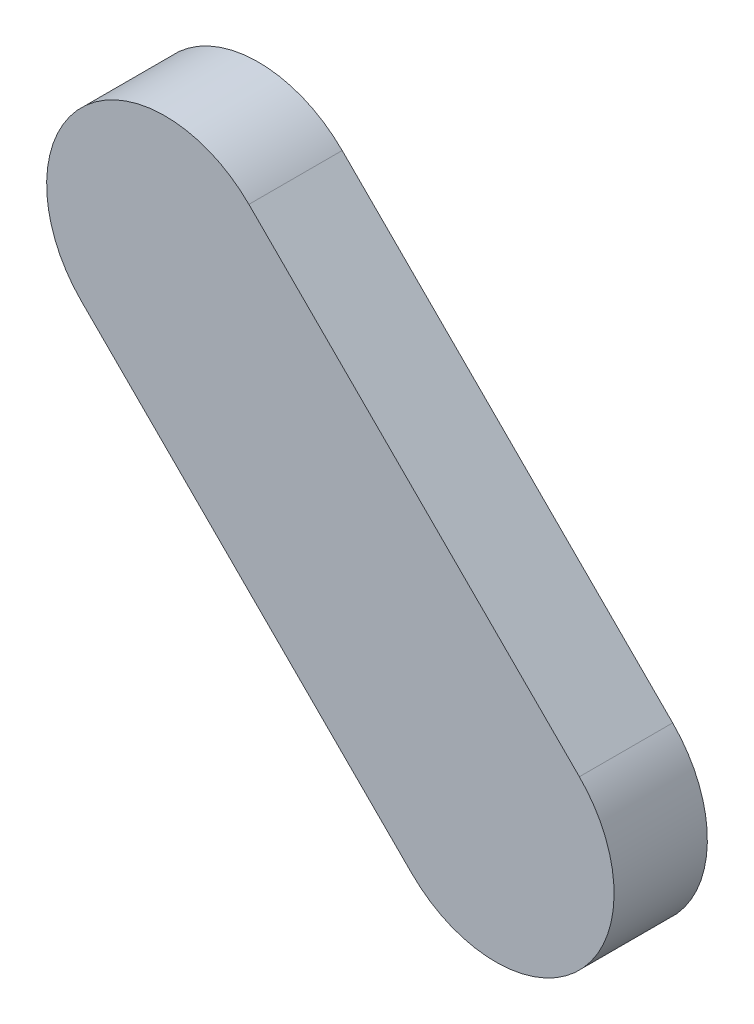
ISO-10303-21;
HEADER;
FILE_DESCRIPTION(('STEP AP214'),'2;1');
FILE_NAME('part.step','',(''),(''),'','','');
FILE_SCHEMA(('AUTOMOTIVE_DESIGN { 1 0 10303 214 1 1 1 1 }'));
ENDSEC;
DATA;
#1=APPLICATION_CONTEXT('core data for automotive mechanical design processes');
#2=APPLICATION_PROTOCOL_DEFINITION('international standard','automotive_design',2000,#1);
#3=PRODUCT_CONTEXT('',#1,'mechanical');
#4=PRODUCT('Part','Part','',(#3));
#5=PRODUCT_RELATED_PRODUCT_CATEGORY('part','',(#4));
#6=PRODUCT_DEFINITION_FORMATION('','',#4);
#7=PRODUCT_DEFINITION_CONTEXT('part definition',#1,'design');
#8=PRODUCT_DEFINITION('design','',#6,#7);
#9=PRODUCT_DEFINITION_SHAPE('','',#8);
#10=(LENGTH_UNIT() NAMED_UNIT(*) SI_UNIT(.MILLI.,.METRE.));
#11=(NAMED_UNIT(*) PLANE_ANGLE_UNIT() SI_UNIT($,.RADIAN.));
#12=(NAMED_UNIT(*) SI_UNIT($,.STERADIAN.) SOLID_ANGLE_UNIT());
#13=UNCERTAINTY_MEASURE_WITH_UNIT(LENGTH_MEASURE(1.E-05),#10,'distance_accuracy_value','');
#14=(GEOMETRIC_REPRESENTATION_CONTEXT(3) GLOBAL_UNCERTAINTY_ASSIGNED_CONTEXT((#13)) GLOBAL_UNIT_ASSIGNED_CONTEXT((#10,
#11,#12)) REPRESENTATION_CONTEXT('',''));
#15=CARTESIAN_POINT('',(0.,0.,0.));
#16=DIRECTION('',(0.,0.,1.));
#17=DIRECTION('',(1.,0.,0.));
#18=AXIS2_PLACEMENT_3D('',#15,#16,#17);
#19=CARTESIAN_POINT('',(147.1403966,67.25739406,0.));
#20=DIRECTION('',(0.707106781186548,0.707106781186548,0.));
#21=DIRECTION('',(0.707106781186548,-0.707106781186548,0.));
#22=AXIS2_PLACEMENT_3D('',#19,#20,#21);
#23=PLANE('',#22);
#24=DIRECTION('',(0.707106781186548,-0.707106781186548,0.));
#25=VECTOR('',#24,1.);
#26=CARTESIAN_POINT('',(147.1403966,67.25739406,0.1999996));
#27=LINE('',#26,#25);
#28=CARTESIAN_POINT('',(147.1403966,67.25739406,0.1999996));
#29=VERTEX_POINT('',#28);
#30=CARTESIAN_POINT('',(147.84890166,66.548889,0.1999996));
#31=VERTEX_POINT('',#30);
#32=EDGE_CURVE('E11',#29,#31,#27,.T.);
#33=ORIENTED_EDGE('',*,*,#32,.F.);
#34=DIRECTION('',(0.,0.,1.));
#35=VECTOR('',#34,1.);
#36=CARTESIAN_POINT('',(147.1403966,67.25739406,0.));
#37=LINE('',#36,#35);
#38=CARTESIAN_POINT('',(147.1403966,67.25739406,0.));
#39=VERTEX_POINT('',#38);
#40=EDGE_CURVE('E24',#39,#29,#37,.T.);
#41=ORIENTED_EDGE('',*,*,#40,.F.);
#42=DIRECTION('',(0.707106781186548,-0.707106781186548,0.));
#43=VECTOR('',#42,1.);
#44=CARTESIAN_POINT('',(147.1403966,67.25739406,0.));
#45=LINE('',#44,#43);
#46=CARTESIAN_POINT('',(147.84890166,66.548889,0.));
#47=VERTEX_POINT('',#46);
#48=EDGE_CURVE('E75',#39,#47,#45,.T.);
#49=ORIENTED_EDGE('',*,*,#48,.T.);
#50=DIRECTION('',(0.,0.,1.));
#51=VECTOR('',#50,1.);
#52=CARTESIAN_POINT('',(147.84890166,66.548889,0.));
#53=LINE('',#52,#51);
#54=EDGE_CURVE('E37',#47,#31,#53,.T.);
#55=ORIENTED_EDGE('',*,*,#54,.T.);
#56=EDGE_LOOP('',(#33,#41,#49,#55));
#57=FACE_BOUND('',#56,.T.);
#58=ADVANCED_FACE('F17',(#57),#23,.F.);
#59=CARTESIAN_POINT('',(148.02850633,66.72849367,0.));
#60=DIRECTION('',(0.,0.,-1.));
#61=DIRECTION('',(-0.707106781186492,-0.707106781186603,0.));
#62=AXIS2_PLACEMENT_3D('',#59,#60,#61);
#63=CYLINDRICAL_SURFACE('',#62,0.253999360179542);
#64=CARTESIAN_POINT('',(148.02850633,66.72849367,0.1999996));
#65=DIRECTION('',(0.,0.,1.));
#66=DIRECTION('',(-0.707106781186492,-0.707106781186603,0.));
#67=AXIS2_PLACEMENT_3D('',#64,#65,#66);
#68=CIRCLE('',#67,0.253999360179542);
#69=CARTESIAN_POINT('',(148.208111,66.90809834,0.1999996));
#70=VERTEX_POINT('',#69);
#71=EDGE_CURVE('E83',#31,#70,#68,.T.);
#72=ORIENTED_EDGE('',*,*,#71,.F.);
#73=ORIENTED_EDGE('',*,*,#54,.F.);
#74=CARTESIAN_POINT('',(148.02850633,66.72849367,0.));
#75=DIRECTION('',(0.,0.,1.));
#76=DIRECTION('',(-0.707106781186492,-0.707106781186603,0.));
#77=AXIS2_PLACEMENT_3D('',#74,#75,#76);
#78=CIRCLE('',#77,0.253999360179542);
#79=CARTESIAN_POINT('',(148.208111,66.90809834,0.));
#80=VERTEX_POINT('',#79);
#81=EDGE_CURVE('E81',#47,#80,#78,.T.);
#82=ORIENTED_EDGE('',*,*,#81,.T.);
#83=DIRECTION('',(0.,0.,1.));
#84=VECTOR('',#83,1.);
#85=CARTESIAN_POINT('',(148.208111,66.90809834,0.));
#86=LINE('',#85,#84);
#87=EDGE_CURVE('E67',#80,#70,#86,.T.);
#88=ORIENTED_EDGE('',*,*,#87,.T.);
#89=EDGE_LOOP('',(#72,#73,#82,#88));
#90=FACE_BOUND('',#89,.T.);
#91=ADVANCED_FACE('F89',(#90),#63,.T.);
#92=CARTESIAN_POINT('',(148.208111,66.90809834,0.));
#93=DIRECTION('',(-0.707106781186548,-0.707106781186548,0.));
#94=DIRECTION('',(-0.707106781186548,0.707106781186548,0.));
#95=AXIS2_PLACEMENT_3D('',#92,#93,#94);
#96=PLANE('',#95);
#97=DIRECTION('',(-0.707106781186548,0.707106781186548,0.));
#98=VECTOR('',#97,1.);
#99=CARTESIAN_POINT('',(148.208111,66.90809834,0.1999996));
#100=LINE('',#99,#98);
#101=CARTESIAN_POINT('',(147.49960594,67.6166034,0.1999996));
#102=VERTEX_POINT('',#101);
#103=EDGE_CURVE('E71',#70,#102,#100,.T.);
#104=ORIENTED_EDGE('',*,*,#103,.F.);
#105=ORIENTED_EDGE('',*,*,#87,.F.);
#106=DIRECTION('',(-0.707106781186548,0.707106781186548,0.));
#107=VECTOR('',#106,1.);
#108=CARTESIAN_POINT('',(148.208111,66.90809834,0.));
#109=LINE('',#108,#107);
#110=CARTESIAN_POINT('',(147.49960594,67.6166034,0.));
#111=VERTEX_POINT('',#110);
#112=EDGE_CURVE('E63',#80,#111,#109,.T.);
#113=ORIENTED_EDGE('',*,*,#112,.T.);
#114=DIRECTION('',(0.,0.,1.));
#115=VECTOR('',#114,1.);
#116=CARTESIAN_POINT('',(147.49960594,67.6166034,0.));
#117=LINE('',#116,#115);
#118=EDGE_CURVE('E53',#111,#102,#117,.T.);
#119=ORIENTED_EDGE('',*,*,#118,.T.);
#120=EDGE_LOOP('',(#104,#105,#113,#119));
#121=FACE_BOUND('',#120,.T.);
#122=ADVANCED_FACE('F66',(#121),#96,.F.);
#123=CARTESIAN_POINT('',(147.32000127,67.43699873,0.));
#124=DIRECTION('',(0.,0.,-1.));
#125=DIRECTION('',(0.707106781186548,0.707106781186548,0.));
#126=AXIS2_PLACEMENT_3D('',#123,#124,#125);
#127=CYLINDRICAL_SURFACE('',#126,0.253999360179536);
#128=CARTESIAN_POINT('',(147.32000127,67.43699873,0.1999996));
#129=DIRECTION('',(0.,0.,1.));
#130=DIRECTION('',(0.707106781186548,0.707106781186548,0.));
#131=AXIS2_PLACEMENT_3D('',#128,#129,#130);
#132=CIRCLE('',#131,0.253999360179536);
#133=EDGE_CURVE('E59',#102,#29,#132,.T.);
#134=ORIENTED_EDGE('',*,*,#133,.F.);
#135=ORIENTED_EDGE('',*,*,#118,.F.);
#136=CARTESIAN_POINT('',(147.32000127,67.43699873,0.));
#137=DIRECTION('',(0.,0.,1.));
#138=DIRECTION('',(0.707106781186548,0.707106781186548,0.));
#139=AXIS2_PLACEMENT_3D('',#136,#137,#138);
#140=CIRCLE('',#139,0.253999360179536);
#141=EDGE_CURVE('E57',#111,#39,#140,.T.);
#142=ORIENTED_EDGE('',*,*,#141,.T.);
#143=ORIENTED_EDGE('',*,*,#40,.T.);
#144=EDGE_LOOP('',(#134,#135,#142,#143));
#145=FACE_BOUND('',#144,.T.);
#146=ADVANCED_FACE('F55',(#145),#127,.T.);
#147=CARTESIAN_POINT('',(147.1403966,67.25739406,0.));
#148=DIRECTION('',(0.,0.,-1.));
#149=DIRECTION('',(-1.,0.,0.));
#150=AXIS2_PLACEMENT_3D('',#147,#148,#149);
#151=PLANE('',#150);
#152=ORIENTED_EDGE('',*,*,#141,.F.);
#153=ORIENTED_EDGE('',*,*,#112,.F.);
#154=ORIENTED_EDGE('',*,*,#81,.F.);
#155=ORIENTED_EDGE('',*,*,#48,.F.);
#156=EDGE_LOOP('',(#152,#153,#154,#155));
#157=FACE_BOUND('',#156,.T.);
#158=ADVANCED_FACE('F74',(#157),#151,.T.);
#159=CARTESIAN_POINT('',(147.1403966,67.25739406,0.1999996));
#160=DIRECTION('',(0.,0.,-1.));
#161=DIRECTION('',(-1.,0.,0.));
#162=AXIS2_PLACEMENT_3D('',#159,#160,#161);
#163=PLANE('',#162);
#164=ORIENTED_EDGE('',*,*,#32,.T.);
#165=ORIENTED_EDGE('',*,*,#71,.T.);
#166=ORIENTED_EDGE('',*,*,#103,.T.);
#167=ORIENTED_EDGE('',*,*,#133,.T.);
#168=EDGE_LOOP('',(#164,#165,#166,#167));
#169=FACE_BOUND('',#168,.T.);
#170=ADVANCED_FACE('F91',(#169),#163,.F.);
#171=CLOSED_SHELL('',(#58,#91,#122,#146,#158,#170));
#172=MANIFOLD_SOLID_BREP('B1',#171);
#173=ADVANCED_BREP_SHAPE_REPRESENTATION('',(#18,#172),#14);
#174=SHAPE_DEFINITION_REPRESENTATION(#9,#173);
ENDSEC;
END-ISO-10303-21;
